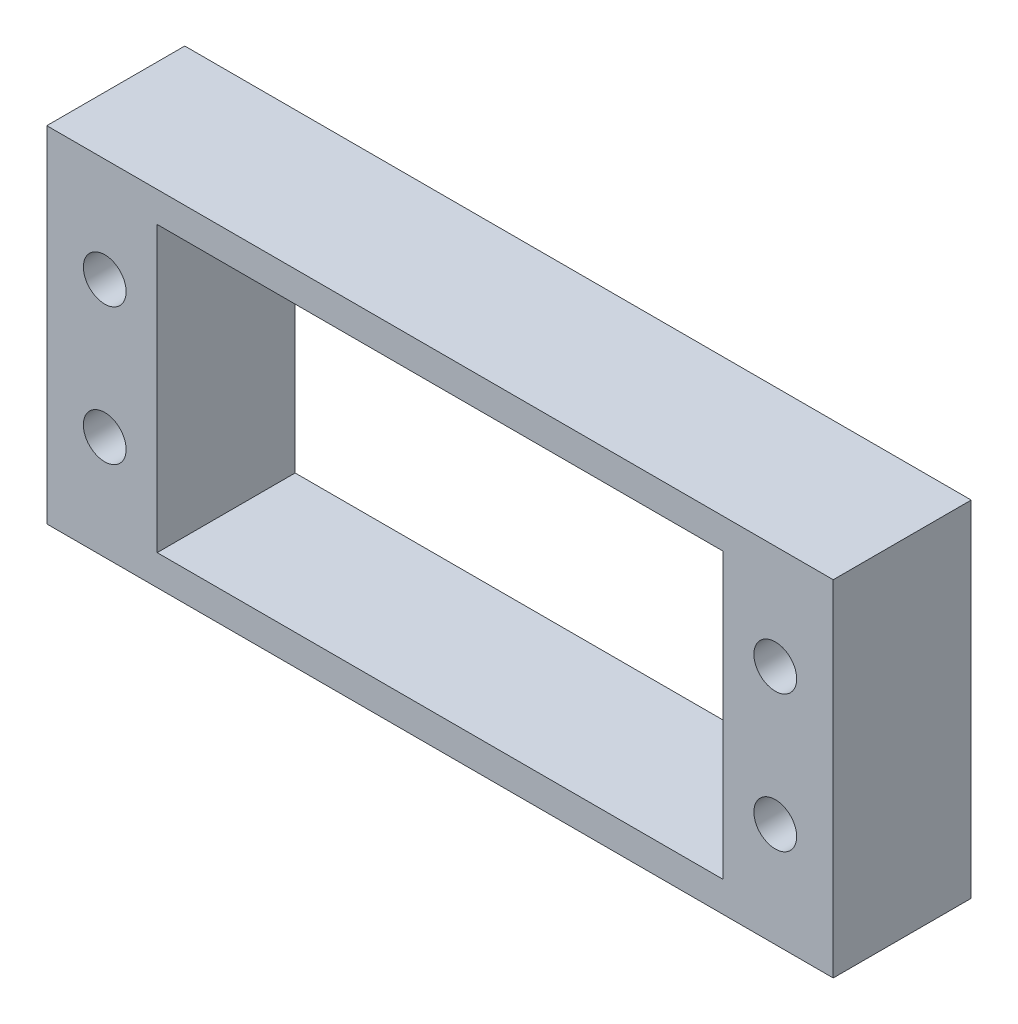
ISO-10303-21;
HEADER;
FILE_DESCRIPTION(('STEP AP214'),'2;1');
FILE_NAME('part.step','',(''),(''),'','','');
FILE_SCHEMA(('AUTOMOTIVE_DESIGN { 1 0 10303 214 1 1 1 1 }'));
ENDSEC;
DATA;
#1=APPLICATION_CONTEXT('core data for automotive mechanical design processes');
#2=APPLICATION_PROTOCOL_DEFINITION('international standard','automotive_design',2000,#1);
#3=PRODUCT_CONTEXT('',#1,'mechanical');
#4=PRODUCT('Part','Part','',(#3));
#5=PRODUCT_RELATED_PRODUCT_CATEGORY('part','',(#4));
#6=PRODUCT_DEFINITION_FORMATION('','',#4);
#7=PRODUCT_DEFINITION_CONTEXT('part definition',#1,'design');
#8=PRODUCT_DEFINITION('design','',#6,#7);
#9=PRODUCT_DEFINITION_SHAPE('','',#8);
#10=(LENGTH_UNIT() NAMED_UNIT(*) SI_UNIT(.MILLI.,.METRE.));
#11=(NAMED_UNIT(*) PLANE_ANGLE_UNIT() SI_UNIT($,.RADIAN.));
#12=(NAMED_UNIT(*) SI_UNIT($,.STERADIAN.) SOLID_ANGLE_UNIT());
#13=UNCERTAINTY_MEASURE_WITH_UNIT(LENGTH_MEASURE(1.E-05),#10,'distance_accuracy_value','');
#14=(GEOMETRIC_REPRESENTATION_CONTEXT(3) GLOBAL_UNCERTAINTY_ASSIGNED_CONTEXT((#13)) GLOBAL_UNIT_ASSIGNED_CONTEXT((#10,
#11,#12)) REPRESENTATION_CONTEXT('',''));
#15=CARTESIAN_POINT('',(0.,0.,0.));
#16=DIRECTION('',(0.,0.,1.));
#17=DIRECTION('',(1.,0.,0.));
#18=AXIS2_PLACEMENT_3D('',#15,#16,#17);
#19=CARTESIAN_POINT('',(0.,0.,10.));
#20=DIRECTION('',(0.,0.,-1.));
#21=DIRECTION('',(-1.,0.,0.));
#22=AXIS2_PLACEMENT_3D('',#19,#20,#21);
#23=PLANE('',#22);
#24=CARTESIAN_POINT('',(24.3,-4.95,10.));
#25=DIRECTION('',(0.,0.,1.));
#26=DIRECTION('',(-1.,0.,0.));
#27=AXIS2_PLACEMENT_3D('',#24,#25,#26);
#28=CIRCLE('',#27,1.55);
#29=CARTESIAN_POINT('',(22.75,-4.95,10.));
#30=VERTEX_POINT('',#29);
#31=EDGE_CURVE('E136',#30,#30,#28,.T.);
#32=ORIENTED_EDGE('',*,*,#31,.F.);
#33=EDGE_LOOP('',(#32));
#34=FACE_BOUND('',#33,.T.);
#35=CARTESIAN_POINT('',(-24.3,-4.95,10.));
#36=DIRECTION('',(0.,0.,1.));
#37=DIRECTION('',(1.,0.,0.));
#38=AXIS2_PLACEMENT_3D('',#35,#36,#37);
#39=CIRCLE('',#38,1.55);
#40=CARTESIAN_POINT('',(-22.75,-4.95,10.));
#41=VERTEX_POINT('',#40);
#42=EDGE_CURVE('E142',#41,#41,#39,.T.);
#43=ORIENTED_EDGE('',*,*,#42,.F.);
#44=EDGE_LOOP('',(#43));
#45=FACE_BOUND('',#44,.T.);
#46=CARTESIAN_POINT('',(-24.3,4.95,10.));
#47=DIRECTION('',(0.,0.,1.));
#48=DIRECTION('',(-1.,0.,0.));
#49=AXIS2_PLACEMENT_3D('',#46,#47,#48);
#50=CIRCLE('',#49,1.55);
#51=CARTESIAN_POINT('',(-25.85,4.95,10.));
#52=VERTEX_POINT('',#51);
#53=EDGE_CURVE('E148',#52,#52,#50,.T.);
#54=ORIENTED_EDGE('',*,*,#53,.F.);
#55=EDGE_LOOP('',(#54));
#56=FACE_BOUND('',#55,.T.);
#57=CARTESIAN_POINT('',(24.3,4.95,10.));
#58=DIRECTION('',(0.,0.,1.));
#59=DIRECTION('',(1.,0.,0.));
#60=AXIS2_PLACEMENT_3D('',#57,#58,#59);
#61=CIRCLE('',#60,1.55);
#62=CARTESIAN_POINT('',(25.85,4.95,10.));
#63=VERTEX_POINT('',#62);
#64=EDGE_CURVE('E154',#63,#63,#61,.T.);
#65=ORIENTED_EDGE('',*,*,#64,.F.);
#66=EDGE_LOOP('',(#65));
#67=FACE_BOUND('',#66,.T.);
#68=DIRECTION('',(0.,1.,0.));
#69=VECTOR('',#68,1.);
#70=CARTESIAN_POINT('',(28.5,-12.5,10.));
#71=LINE('',#70,#69);
#72=CARTESIAN_POINT('',(28.5,-12.5,10.));
#73=VERTEX_POINT('',#72);
#74=CARTESIAN_POINT('',(28.5,12.5,10.));
#75=VERTEX_POINT('',#74);
#76=EDGE_CURVE('E160',#73,#75,#71,.T.);
#77=ORIENTED_EDGE('',*,*,#76,.T.);
#78=DIRECTION('',(-1.,0.,0.));
#79=VECTOR('',#78,1.);
#80=CARTESIAN_POINT('',(-28.5,12.5,10.));
#81=LINE('',#80,#79);
#82=CARTESIAN_POINT('',(-28.5,12.5,10.));
#83=VERTEX_POINT('',#82);
#84=EDGE_CURVE('E163',#75,#83,#81,.T.);
#85=ORIENTED_EDGE('',*,*,#84,.T.);
#86=DIRECTION('',(0.,-1.,0.));
#87=VECTOR('',#86,1.);
#88=CARTESIAN_POINT('',(-28.5,-12.5,10.));
#89=LINE('',#88,#87);
#90=CARTESIAN_POINT('',(-28.5,-12.5,10.));
#91=VERTEX_POINT('',#90);
#92=EDGE_CURVE('E166',#83,#91,#89,.T.);
#93=ORIENTED_EDGE('',*,*,#92,.T.);
#94=DIRECTION('',(1.,0.,0.));
#95=VECTOR('',#94,1.);
#96=CARTESIAN_POINT('',(-28.5,-12.5,10.));
#97=LINE('',#96,#95);
#98=EDGE_CURVE('E168',#91,#73,#97,.T.);
#99=ORIENTED_EDGE('',*,*,#98,.T.);
#100=EDGE_LOOP('',(#77,#85,#93,#99));
#101=FACE_BOUND('',#100,.T.);
#102=DIRECTION('',(0.,1.,0.));
#103=VECTOR('',#102,1.);
#104=CARTESIAN_POINT('',(20.5,-10.3,10.));
#105=LINE('',#104,#103);
#106=CARTESIAN_POINT('',(20.5,-10.3,10.));
#107=VERTEX_POINT('',#106);
#108=CARTESIAN_POINT('',(20.5,10.3,10.));
#109=VERTEX_POINT('',#108);
#110=EDGE_CURVE('E100',#107,#109,#105,.T.);
#111=ORIENTED_EDGE('',*,*,#110,.F.);
#112=DIRECTION('',(1.,0.,0.));
#113=VECTOR('',#112,1.);
#114=CARTESIAN_POINT('',(-20.5,-10.3,10.));
#115=LINE('',#114,#113);
#116=CARTESIAN_POINT('',(-20.5,-10.3,10.));
#117=VERTEX_POINT('',#116);
#118=EDGE_CURVE('E122',#117,#107,#115,.T.);
#119=ORIENTED_EDGE('',*,*,#118,.F.);
#120=DIRECTION('',(0.,-1.,0.));
#121=VECTOR('',#120,1.);
#122=CARTESIAN_POINT('',(-20.5,-10.3,10.));
#123=LINE('',#122,#121);
#124=CARTESIAN_POINT('',(-20.5,10.3,10.));
#125=VERTEX_POINT('',#124);
#126=EDGE_CURVE('E120',#125,#117,#123,.T.);
#127=ORIENTED_EDGE('',*,*,#126,.F.);
#128=DIRECTION('',(-1.,0.,0.));
#129=VECTOR('',#128,1.);
#130=CARTESIAN_POINT('',(-20.5,10.3,10.));
#131=LINE('',#130,#129);
#132=EDGE_CURVE('E108',#109,#125,#131,.T.);
#133=ORIENTED_EDGE('',*,*,#132,.F.);
#134=EDGE_LOOP('',(#111,#119,#127,#133));
#135=FACE_BOUND('',#134,.T.);
#136=ADVANCED_FACE('F35',(#34,#45,#56,#67,#101,#135),#23,.F.);
#137=CARTESIAN_POINT('',(0.,0.,0.));
#138=DIRECTION('',(0.,0.,-1.));
#139=DIRECTION('',(-1.,0.,0.));
#140=AXIS2_PLACEMENT_3D('',#137,#138,#139);
#141=PLANE('',#140);
#142=CARTESIAN_POINT('',(-24.3,-4.95,0.));
#143=DIRECTION('',(0.,0.,1.));
#144=DIRECTION('',(1.,0.,0.));
#145=AXIS2_PLACEMENT_3D('',#142,#143,#144);
#146=CIRCLE('',#145,1.55);
#147=CARTESIAN_POINT('',(-22.75,-4.95,0.));
#148=VERTEX_POINT('',#147);
#149=EDGE_CURVE('E139',#148,#148,#146,.T.);
#150=ORIENTED_EDGE('',*,*,#149,.T.);
#151=EDGE_LOOP('',(#150));
#152=FACE_BOUND('',#151,.T.);
#153=CARTESIAN_POINT('',(24.3,4.95,0.));
#154=DIRECTION('',(0.,0.,1.));
#155=DIRECTION('',(1.,0.,0.));
#156=AXIS2_PLACEMENT_3D('',#153,#154,#155);
#157=CIRCLE('',#156,1.55);
#158=CARTESIAN_POINT('',(25.85,4.95,0.));
#159=VERTEX_POINT('',#158);
#160=EDGE_CURVE('E151',#159,#159,#157,.T.);
#161=ORIENTED_EDGE('',*,*,#160,.T.);
#162=EDGE_LOOP('',(#161));
#163=FACE_BOUND('',#162,.T.);
#164=DIRECTION('',(0.,1.,0.));
#165=VECTOR('',#164,1.);
#166=CARTESIAN_POINT('',(28.5,-12.5,0.));
#167=LINE('',#166,#165);
#168=CARTESIAN_POINT('',(28.5,-12.5,0.));
#169=VERTEX_POINT('',#168);
#170=CARTESIAN_POINT('',(28.5,12.5,0.));
#171=VERTEX_POINT('',#170);
#172=EDGE_CURVE('E157',#169,#171,#167,.T.);
#173=ORIENTED_EDGE('',*,*,#172,.F.);
#174=DIRECTION('',(1.,0.,0.));
#175=VECTOR('',#174,1.);
#176=CARTESIAN_POINT('',(-28.5,-12.5,0.));
#177=LINE('',#176,#175);
#178=CARTESIAN_POINT('',(-28.5,-12.5,0.));
#179=VERTEX_POINT('',#178);
#180=EDGE_CURVE('E164',#179,#169,#177,.T.);
#181=ORIENTED_EDGE('',*,*,#180,.F.);
#182=DIRECTION('',(0.,-1.,0.));
#183=VECTOR('',#182,1.);
#184=CARTESIAN_POINT('',(-28.5,-12.5,0.));
#185=LINE('',#184,#183);
#186=CARTESIAN_POINT('',(-28.5,12.5,0.));
#187=VERTEX_POINT('',#186);
#188=EDGE_CURVE('E175',#187,#179,#185,.T.);
#189=ORIENTED_EDGE('',*,*,#188,.F.);
#190=DIRECTION('',(-1.,0.,0.));
#191=VECTOR('',#190,1.);
#192=CARTESIAN_POINT('',(-28.5,12.5,0.));
#193=LINE('',#192,#191);
#194=EDGE_CURVE('E173',#171,#187,#193,.T.);
#195=ORIENTED_EDGE('',*,*,#194,.F.);
#196=EDGE_LOOP('',(#173,#181,#189,#195));
#197=FACE_BOUND('',#196,.T.);
#198=CARTESIAN_POINT('',(-24.3,4.95,0.));
#199=DIRECTION('',(0.,0.,1.));
#200=DIRECTION('',(-1.,0.,0.));
#201=AXIS2_PLACEMENT_3D('',#198,#199,#200);
#202=CIRCLE('',#201,1.55);
#203=CARTESIAN_POINT('',(-25.85,4.95,0.));
#204=VERTEX_POINT('',#203);
#205=EDGE_CURVE('E145',#204,#204,#202,.T.);
#206=ORIENTED_EDGE('',*,*,#205,.T.);
#207=EDGE_LOOP('',(#206));
#208=FACE_BOUND('',#207,.T.);
#209=CARTESIAN_POINT('',(24.3,-4.95,0.));
#210=DIRECTION('',(0.,0.,1.));
#211=DIRECTION('',(-1.,0.,0.));
#212=AXIS2_PLACEMENT_3D('',#209,#210,#211);
#213=CIRCLE('',#212,1.55);
#214=CARTESIAN_POINT('',(22.75,-4.95,0.));
#215=VERTEX_POINT('',#214);
#216=EDGE_CURVE('E116',#215,#215,#213,.T.);
#217=ORIENTED_EDGE('',*,*,#216,.T.);
#218=EDGE_LOOP('',(#217));
#219=FACE_BOUND('',#218,.T.);
#220=DIRECTION('',(1.,0.,0.));
#221=VECTOR('',#220,1.);
#222=CARTESIAN_POINT('',(-20.5,-10.3,0.));
#223=LINE('',#222,#221);
#224=CARTESIAN_POINT('',(-20.5,-10.3,0.));
#225=VERTEX_POINT('',#224);
#226=CARTESIAN_POINT('',(20.5,-10.3,0.));
#227=VERTEX_POINT('',#226);
#228=EDGE_CURVE('E109',#225,#227,#223,.T.);
#229=ORIENTED_EDGE('',*,*,#228,.T.);
#230=DIRECTION('',(0.,1.,0.));
#231=VECTOR('',#230,1.);
#232=CARTESIAN_POINT('',(20.5,-10.3,0.));
#233=LINE('',#232,#231);
#234=CARTESIAN_POINT('',(20.5,10.3,0.));
#235=VERTEX_POINT('',#234);
#236=EDGE_CURVE('E58',#227,#235,#233,.T.);
#237=ORIENTED_EDGE('',*,*,#236,.T.);
#238=DIRECTION('',(-1.,0.,0.));
#239=VECTOR('',#238,1.);
#240=CARTESIAN_POINT('',(-20.5,10.3,0.));
#241=LINE('',#240,#239);
#242=CARTESIAN_POINT('',(-20.5,10.3,0.));
#243=VERTEX_POINT('',#242);
#244=EDGE_CURVE('E115',#235,#243,#241,.T.);
#245=ORIENTED_EDGE('',*,*,#244,.T.);
#246=DIRECTION('',(0.,-1.,0.));
#247=VECTOR('',#246,1.);
#248=CARTESIAN_POINT('',(-20.5,-10.3,0.));
#249=LINE('',#248,#247);
#250=EDGE_CURVE('E128',#243,#225,#249,.T.);
#251=ORIENTED_EDGE('',*,*,#250,.T.);
#252=EDGE_LOOP('',(#229,#237,#245,#251));
#253=FACE_BOUND('',#252,.T.);
#254=ADVANCED_FACE('F193',(#152,#163,#197,#208,#219,#253),#141,.T.);
#255=CARTESIAN_POINT('',(28.5,-12.5,10.));
#256=DIRECTION('',(-1.,0.,0.));
#257=DIRECTION('',(0.,0.,1.));
#258=AXIS2_PLACEMENT_3D('',#255,#256,#257);
#259=PLANE('',#258);
#260=ORIENTED_EDGE('',*,*,#172,.T.);
#261=DIRECTION('',(0.,0.,-1.));
#262=VECTOR('',#261,1.);
#263=CARTESIAN_POINT('',(28.5,12.5,10.));
#264=LINE('',#263,#262);
#265=EDGE_CURVE('E11',#75,#171,#264,.T.);
#266=ORIENTED_EDGE('',*,*,#265,.F.);
#267=ORIENTED_EDGE('',*,*,#76,.F.);
#268=DIRECTION('',(0.,0.,-1.));
#269=VECTOR('',#268,1.);
#270=CARTESIAN_POINT('',(28.5,-12.5,10.));
#271=LINE('',#270,#269);
#272=EDGE_CURVE('E170',#73,#169,#271,.T.);
#273=ORIENTED_EDGE('',*,*,#272,.T.);
#274=EDGE_LOOP('',(#260,#266,#267,#273));
#275=FACE_BOUND('',#274,.T.);
#276=ADVANCED_FACE('F37',(#275),#259,.F.);
#277=CARTESIAN_POINT('',(-28.5,12.5,10.));
#278=DIRECTION('',(0.,-1.,0.));
#279=DIRECTION('',(0.,0.,-1.));
#280=AXIS2_PLACEMENT_3D('',#277,#278,#279);
#281=PLANE('',#280);
#282=ORIENTED_EDGE('',*,*,#194,.T.);
#283=DIRECTION('',(0.,0.,-1.));
#284=VECTOR('',#283,1.);
#285=CARTESIAN_POINT('',(-28.5,12.5,10.));
#286=LINE('',#285,#284);
#287=EDGE_CURVE('E43',#83,#187,#286,.T.);
#288=ORIENTED_EDGE('',*,*,#287,.F.);
#289=ORIENTED_EDGE('',*,*,#84,.F.);
#290=ORIENTED_EDGE('',*,*,#265,.T.);
#291=EDGE_LOOP('',(#282,#288,#289,#290));
#292=FACE_BOUND('',#291,.T.);
#293=ADVANCED_FACE('F203',(#292),#281,.F.);
#294=CARTESIAN_POINT('',(-28.5,-12.5,10.));
#295=DIRECTION('',(1.,0.,0.));
#296=DIRECTION('',(0.,0.,-1.));
#297=AXIS2_PLACEMENT_3D('',#294,#295,#296);
#298=PLANE('',#297);
#299=ORIENTED_EDGE('',*,*,#188,.T.);
#300=DIRECTION('',(0.,0.,-1.));
#301=VECTOR('',#300,1.);
#302=CARTESIAN_POINT('',(-28.5,-12.5,10.));
#303=LINE('',#302,#301);
#304=EDGE_CURVE('E180',#91,#179,#303,.T.);
#305=ORIENTED_EDGE('',*,*,#304,.F.);
#306=ORIENTED_EDGE('',*,*,#92,.F.);
#307=ORIENTED_EDGE('',*,*,#287,.T.);
#308=EDGE_LOOP('',(#299,#305,#306,#307));
#309=FACE_BOUND('',#308,.T.);
#310=ADVANCED_FACE('F187',(#309),#298,.F.);
#311=CARTESIAN_POINT('',(-28.5,-12.5,10.));
#312=DIRECTION('',(0.,1.,0.));
#313=DIRECTION('',(0.,0.,1.));
#314=AXIS2_PLACEMENT_3D('',#311,#312,#313);
#315=PLANE('',#314);
#316=ORIENTED_EDGE('',*,*,#180,.T.);
#317=ORIENTED_EDGE('',*,*,#272,.F.);
#318=ORIENTED_EDGE('',*,*,#98,.F.);
#319=ORIENTED_EDGE('',*,*,#304,.T.);
#320=EDGE_LOOP('',(#316,#317,#318,#319));
#321=FACE_BOUND('',#320,.T.);
#322=ADVANCED_FACE('F197',(#321),#315,.F.);
#323=CARTESIAN_POINT('',(24.3,4.95,10.));
#324=DIRECTION('',(0.,0.,-1.));
#325=DIRECTION('',(-1.,0.,0.));
#326=AXIS2_PLACEMENT_3D('',#323,#324,#325);
#327=CYLINDRICAL_SURFACE('',#326,1.55);
#328=ORIENTED_EDGE('',*,*,#64,.T.);
#329=EDGE_LOOP('',(#328));
#330=FACE_BOUND('',#329,.T.);
#331=ORIENTED_EDGE('',*,*,#160,.F.);
#332=EDGE_LOOP('',(#331));
#333=FACE_BOUND('',#332,.T.);
#334=ADVANCED_FACE('F221',(#330,#333),#327,.F.);
#335=CARTESIAN_POINT('',(-24.3,4.95,10.));
#336=DIRECTION('',(0.,0.,-1.));
#337=DIRECTION('',(-1.,0.,0.));
#338=AXIS2_PLACEMENT_3D('',#335,#336,#337);
#339=CYLINDRICAL_SURFACE('',#338,1.55);
#340=ORIENTED_EDGE('',*,*,#53,.T.);
#341=EDGE_LOOP('',(#340));
#342=FACE_BOUND('',#341,.T.);
#343=ORIENTED_EDGE('',*,*,#205,.F.);
#344=EDGE_LOOP('',(#343));
#345=FACE_BOUND('',#344,.T.);
#346=ADVANCED_FACE('F228',(#342,#345),#339,.F.);
#347=CARTESIAN_POINT('',(-24.3,-4.95,10.));
#348=DIRECTION('',(0.,0.,-1.));
#349=DIRECTION('',(-1.,0.,0.));
#350=AXIS2_PLACEMENT_3D('',#347,#348,#349);
#351=CYLINDRICAL_SURFACE('',#350,1.55);
#352=ORIENTED_EDGE('',*,*,#42,.T.);
#353=EDGE_LOOP('',(#352));
#354=FACE_BOUND('',#353,.T.);
#355=ORIENTED_EDGE('',*,*,#149,.F.);
#356=EDGE_LOOP('',(#355));
#357=FACE_BOUND('',#356,.T.);
#358=ADVANCED_FACE('F233',(#354,#357),#351,.F.);
#359=CARTESIAN_POINT('',(24.3,-4.95,10.));
#360=DIRECTION('',(0.,0.,-1.));
#361=DIRECTION('',(-1.,0.,0.));
#362=AXIS2_PLACEMENT_3D('',#359,#360,#361);
#363=CYLINDRICAL_SURFACE('',#362,1.55);
#364=ORIENTED_EDGE('',*,*,#31,.T.);
#365=EDGE_LOOP('',(#364));
#366=FACE_BOUND('',#365,.T.);
#367=ORIENTED_EDGE('',*,*,#216,.F.);
#368=EDGE_LOOP('',(#367));
#369=FACE_BOUND('',#368,.T.);
#370=ADVANCED_FACE('F243',(#366,#369),#363,.F.);
#371=CARTESIAN_POINT('',(20.5,-10.3,10.));
#372=DIRECTION('',(-1.,0.,0.));
#373=DIRECTION('',(0.,0.,1.));
#374=AXIS2_PLACEMENT_3D('',#371,#372,#373);
#375=PLANE('',#374);
#376=ORIENTED_EDGE('',*,*,#236,.F.);
#377=DIRECTION('',(0.,0.,-1.));
#378=VECTOR('',#377,1.);
#379=CARTESIAN_POINT('',(20.5,-10.3,10.));
#380=LINE('',#379,#378);
#381=EDGE_CURVE('E104',#107,#227,#380,.T.);
#382=ORIENTED_EDGE('',*,*,#381,.F.);
#383=ORIENTED_EDGE('',*,*,#110,.T.);
#384=DIRECTION('',(0.,0.,-1.));
#385=VECTOR('',#384,1.);
#386=CARTESIAN_POINT('',(20.5,10.3,10.));
#387=LINE('',#386,#385);
#388=EDGE_CURVE('E103',#109,#235,#387,.T.);
#389=ORIENTED_EDGE('',*,*,#388,.T.);
#390=EDGE_LOOP('',(#376,#382,#383,#389));
#391=FACE_BOUND('',#390,.T.);
#392=ADVANCED_FACE('F102',(#391),#375,.T.);
#393=CARTESIAN_POINT('',(-20.5,10.3,10.));
#394=DIRECTION('',(0.,-1.,0.));
#395=DIRECTION('',(0.,0.,-1.));
#396=AXIS2_PLACEMENT_3D('',#393,#394,#395);
#397=PLANE('',#396);
#398=ORIENTED_EDGE('',*,*,#244,.F.);
#399=ORIENTED_EDGE('',*,*,#388,.F.);
#400=ORIENTED_EDGE('',*,*,#132,.T.);
#401=DIRECTION('',(0.,0.,-1.));
#402=VECTOR('',#401,1.);
#403=CARTESIAN_POINT('',(-20.5,10.3,10.));
#404=LINE('',#403,#402);
#405=EDGE_CURVE('E117',#125,#243,#404,.T.);
#406=ORIENTED_EDGE('',*,*,#405,.T.);
#407=EDGE_LOOP('',(#398,#399,#400,#406));
#408=FACE_BOUND('',#407,.T.);
#409=ADVANCED_FACE('F112',(#408),#397,.T.);
#410=CARTESIAN_POINT('',(-20.5,-10.3,10.));
#411=DIRECTION('',(1.,0.,0.));
#412=DIRECTION('',(0.,0.,-1.));
#413=AXIS2_PLACEMENT_3D('',#410,#411,#412);
#414=PLANE('',#413);
#415=ORIENTED_EDGE('',*,*,#250,.F.);
#416=ORIENTED_EDGE('',*,*,#405,.F.);
#417=ORIENTED_EDGE('',*,*,#126,.T.);
#418=DIRECTION('',(0.,0.,-1.));
#419=VECTOR('',#418,1.);
#420=CARTESIAN_POINT('',(-20.5,-10.3,10.));
#421=LINE('',#420,#419);
#422=EDGE_CURVE('E50',#117,#225,#421,.T.);
#423=ORIENTED_EDGE('',*,*,#422,.T.);
#424=EDGE_LOOP('',(#415,#416,#417,#423));
#425=FACE_BOUND('',#424,.T.);
#426=ADVANCED_FACE('F255',(#425),#414,.T.);
#427=CARTESIAN_POINT('',(-20.5,-10.3,10.));
#428=DIRECTION('',(0.,1.,0.));
#429=DIRECTION('',(0.,0.,1.));
#430=AXIS2_PLACEMENT_3D('',#427,#428,#429);
#431=PLANE('',#430);
#432=ORIENTED_EDGE('',*,*,#228,.F.);
#433=ORIENTED_EDGE('',*,*,#422,.F.);
#434=ORIENTED_EDGE('',*,*,#118,.T.);
#435=ORIENTED_EDGE('',*,*,#381,.T.);
#436=EDGE_LOOP('',(#432,#433,#434,#435));
#437=FACE_BOUND('',#436,.T.);
#438=ADVANCED_FACE('F258',(#437),#431,.T.);
#439=CLOSED_SHELL('',(#136,#254,#276,#293,#310,#322,#334,#346,#358,#370,#392,#409,#426,#438));
#440=MANIFOLD_SOLID_BREP('B2',#439);
#441=ADVANCED_BREP_SHAPE_REPRESENTATION('',(#18,#440),#14);
#442=SHAPE_DEFINITION_REPRESENTATION(#9,#441);
ENDSEC;
END-ISO-10303-21;
